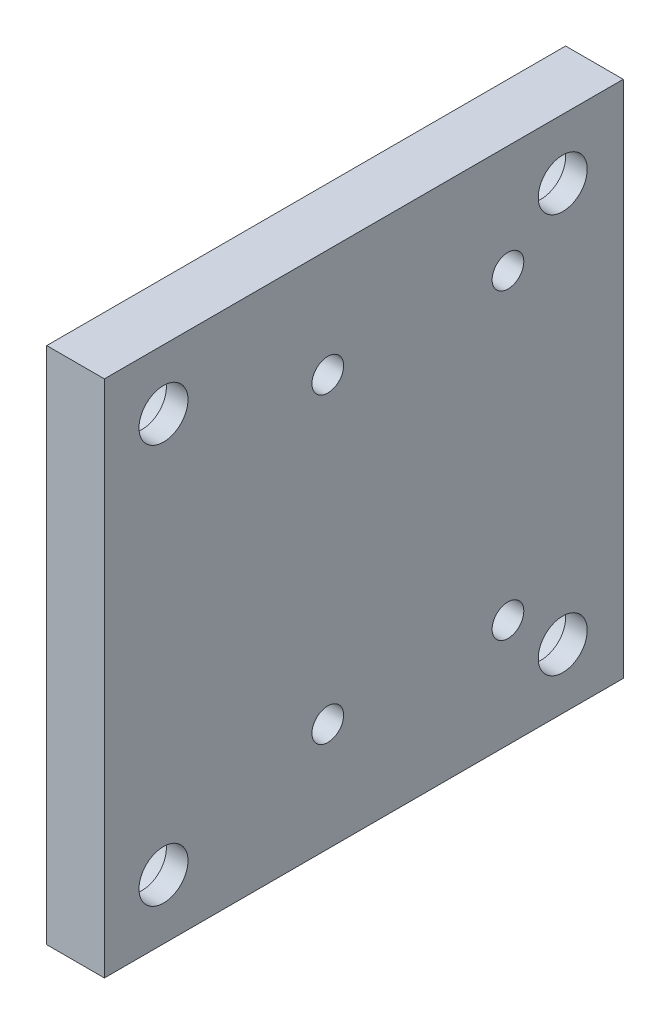
ISO-10303-21;
HEADER;
FILE_DESCRIPTION(('STEP AP214'),'2;1');
FILE_NAME('part.step','',(''),(''),'','','');
FILE_SCHEMA(('AUTOMOTIVE_DESIGN { 1 0 10303 214 1 1 1 1 }'));
ENDSEC;
DATA;
#1=APPLICATION_CONTEXT('core data for automotive mechanical design processes');
#2=APPLICATION_PROTOCOL_DEFINITION('international standard','automotive_design',2000,#1);
#3=PRODUCT_CONTEXT('',#1,'mechanical');
#4=PRODUCT('Part','Part','',(#3));
#5=PRODUCT_RELATED_PRODUCT_CATEGORY('part','',(#4));
#6=PRODUCT_DEFINITION_FORMATION('','',#4);
#7=PRODUCT_DEFINITION_CONTEXT('part definition',#1,'design');
#8=PRODUCT_DEFINITION('design','',#6,#7);
#9=PRODUCT_DEFINITION_SHAPE('','',#8);
#10=(LENGTH_UNIT() NAMED_UNIT(*) SI_UNIT(.MILLI.,.METRE.));
#11=(NAMED_UNIT(*) PLANE_ANGLE_UNIT() SI_UNIT($,.RADIAN.));
#12=(NAMED_UNIT(*) SI_UNIT($,.STERADIAN.) SOLID_ANGLE_UNIT());
#13=UNCERTAINTY_MEASURE_WITH_UNIT(LENGTH_MEASURE(1.E-05),#10,'distance_accuracy_value','');
#14=(GEOMETRIC_REPRESENTATION_CONTEXT(3) GLOBAL_UNCERTAINTY_ASSIGNED_CONTEXT((#13)) GLOBAL_UNIT_ASSIGNED_CONTEXT((#10,
#11,#12)) REPRESENTATION_CONTEXT('',''));
#15=CARTESIAN_POINT('',(0.,0.,0.));
#16=DIRECTION('',(0.,0.,1.));
#17=DIRECTION('',(1.,0.,0.));
#18=AXIS2_PLACEMENT_3D('',#15,#16,#17);
#19=CARTESIAN_POINT('',(-8.9,-18.,112.5));
#20=DIRECTION('',(0.,1.,0.));
#21=DIRECTION('',(0.,0.,1.));
#22=AXIS2_PLACEMENT_3D('',#19,#20,#21);
#23=PLANE('',#22);
#24=DIRECTION('',(0.,0.,-1.));
#25=VECTOR('',#24,1.);
#26=CARTESIAN_POINT('',(-12.9,-18.,112.5));
#27=LINE('',#26,#25);
#28=CARTESIAN_POINT('',(-12.9,-18.,112.5));
#29=VERTEX_POINT('',#28);
#30=CARTESIAN_POINT('',(-12.9,-18.,76.5));
#31=VERTEX_POINT('',#30);
#32=EDGE_CURVE('E107',#29,#31,#27,.T.);
#33=ORIENTED_EDGE('',*,*,#32,.T.);
#34=DIRECTION('',(-1.,0.,0.));
#35=VECTOR('',#34,1.);
#36=CARTESIAN_POINT('',(-8.9,-18.,76.5));
#37=LINE('',#36,#35);
#38=CARTESIAN_POINT('',(-8.9,-18.,76.5));
#39=VERTEX_POINT('',#38);
#40=EDGE_CURVE('E11',#39,#31,#37,.T.);
#41=ORIENTED_EDGE('',*,*,#40,.F.);
#42=DIRECTION('',(0.,0.,-1.));
#43=VECTOR('',#42,1.);
#44=CARTESIAN_POINT('',(-8.9,-18.,112.5));
#45=LINE('',#44,#43);
#46=CARTESIAN_POINT('',(-8.9,-18.,112.5));
#47=VERTEX_POINT('',#46);
#48=EDGE_CURVE('E94',#47,#39,#45,.T.);
#49=ORIENTED_EDGE('',*,*,#48,.F.);
#50=DIRECTION('',(-1.,0.,0.));
#51=VECTOR('',#50,1.);
#52=CARTESIAN_POINT('',(-8.9,-18.,112.5));
#53=LINE('',#52,#51);
#54=EDGE_CURVE('E103',#47,#29,#53,.T.);
#55=ORIENTED_EDGE('',*,*,#54,.T.);
#56=EDGE_LOOP('',(#33,#41,#49,#55));
#57=FACE_BOUND('',#56,.T.);
#58=ADVANCED_FACE('F41',(#57),#23,.F.);
#59=CARTESIAN_POINT('',(-8.9,-18.,76.5));
#60=DIRECTION('',(0.,0.,1.));
#61=DIRECTION('',(1.,0.,0.));
#62=AXIS2_PLACEMENT_3D('',#59,#60,#61);
#63=PLANE('',#62);
#64=DIRECTION('',(0.,1.,0.));
#65=VECTOR('',#64,1.);
#66=CARTESIAN_POINT('',(-12.9,-18.,76.5));
#67=LINE('',#66,#65);
#68=CARTESIAN_POINT('',(-12.9,18.,76.5));
#69=VERTEX_POINT('',#68);
#70=EDGE_CURVE('E98',#31,#69,#67,.T.);
#71=ORIENTED_EDGE('',*,*,#70,.T.);
#72=DIRECTION('',(-1.,0.,0.));
#73=VECTOR('',#72,1.);
#74=CARTESIAN_POINT('',(-8.9,18.,76.5));
#75=LINE('',#74,#73);
#76=CARTESIAN_POINT('',(-8.9,18.,76.5));
#77=VERTEX_POINT('',#76);
#78=EDGE_CURVE('E50',#77,#69,#75,.T.);
#79=ORIENTED_EDGE('',*,*,#78,.F.);
#80=DIRECTION('',(0.,1.,0.));
#81=VECTOR('',#80,1.);
#82=CARTESIAN_POINT('',(-8.9,-18.,76.5));
#83=LINE('',#82,#81);
#84=EDGE_CURVE('E89',#39,#77,#83,.T.);
#85=ORIENTED_EDGE('',*,*,#84,.F.);
#86=ORIENTED_EDGE('',*,*,#40,.T.);
#87=EDGE_LOOP('',(#71,#79,#85,#86));
#88=FACE_BOUND('',#87,.T.);
#89=ADVANCED_FACE('F97',(#88),#63,.F.);
#90=CARTESIAN_POINT('',(-8.9,18.,76.5));
#91=DIRECTION('',(0.,-1.,0.));
#92=DIRECTION('',(0.,0.,-1.));
#93=AXIS2_PLACEMENT_3D('',#90,#91,#92);
#94=PLANE('',#93);
#95=DIRECTION('',(0.,0.,1.));
#96=VECTOR('',#95,1.);
#97=CARTESIAN_POINT('',(-12.9,18.,76.5));
#98=LINE('',#97,#96);
#99=CARTESIAN_POINT('',(-12.9,18.,112.5));
#100=VERTEX_POINT('',#99);
#101=EDGE_CURVE('E76',#69,#100,#98,.T.);
#102=ORIENTED_EDGE('',*,*,#101,.T.);
#103=DIRECTION('',(-1.,0.,0.));
#104=VECTOR('',#103,1.);
#105=CARTESIAN_POINT('',(-8.9,18.,112.5));
#106=LINE('',#105,#104);
#107=CARTESIAN_POINT('',(-8.9,18.,112.5));
#108=VERTEX_POINT('',#107);
#109=EDGE_CURVE('E99',#108,#100,#106,.T.);
#110=ORIENTED_EDGE('',*,*,#109,.F.);
#111=DIRECTION('',(0.,0.,1.));
#112=VECTOR('',#111,1.);
#113=CARTESIAN_POINT('',(-8.9,18.,76.5));
#114=LINE('',#113,#112);
#115=EDGE_CURVE('E92',#77,#108,#114,.T.);
#116=ORIENTED_EDGE('',*,*,#115,.F.);
#117=ORIENTED_EDGE('',*,*,#78,.T.);
#118=EDGE_LOOP('',(#102,#110,#116,#117));
#119=FACE_BOUND('',#118,.T.);
#120=ADVANCED_FACE('F101',(#119),#94,.F.);
#121=CARTESIAN_POINT('',(-8.9,18.,112.5));
#122=DIRECTION('',(0.,0.,-1.));
#123=DIRECTION('',(-1.,0.,0.));
#124=AXIS2_PLACEMENT_3D('',#121,#122,#123);
#125=PLANE('',#124);
#126=DIRECTION('',(0.,-1.,0.));
#127=VECTOR('',#126,1.);
#128=CARTESIAN_POINT('',(-12.9,18.,112.5));
#129=LINE('',#128,#127);
#130=EDGE_CURVE('E82',#100,#29,#129,.T.);
#131=ORIENTED_EDGE('',*,*,#130,.T.);
#132=ORIENTED_EDGE('',*,*,#54,.F.);
#133=DIRECTION('',(0.,-1.,0.));
#134=VECTOR('',#133,1.);
#135=CARTESIAN_POINT('',(-8.9,18.,112.5));
#136=LINE('',#135,#134);
#137=EDGE_CURVE('E59',#108,#47,#136,.T.);
#138=ORIENTED_EDGE('',*,*,#137,.F.);
#139=ORIENTED_EDGE('',*,*,#109,.T.);
#140=EDGE_LOOP('',(#131,#132,#138,#139));
#141=FACE_BOUND('',#140,.T.);
#142=ADVANCED_FACE('F226',(#141),#125,.F.);
#143=CARTESIAN_POINT('',(-8.9,0.,0.));
#144=DIRECTION('',(1.,0.,0.));
#145=DIRECTION('',(0.,0.,-1.));
#146=AXIS2_PLACEMENT_3D('',#143,#144,#145);
#147=PLANE('',#146);
#148=CARTESIAN_POINT('',(-8.9,-10.5,84.5));
#149=DIRECTION('',(1.,0.,0.));
#150=DIRECTION('',(0.,0.,-1.));
#151=AXIS2_PLACEMENT_3D('',#148,#149,#150);
#152=CIRCLE('',#151,1.1);
#153=CARTESIAN_POINT('',(-8.9,-10.5,83.4));
#154=VERTEX_POINT('',#153);
#155=EDGE_CURVE('E162',#154,#154,#152,.F.);
#156=ORIENTED_EDGE('',*,*,#155,.T.);
#157=EDGE_LOOP('',(#156));
#158=FACE_BOUND('',#157,.T.);
#159=CARTESIAN_POINT('',(-8.9,10.5,97.));
#160=DIRECTION('',(1.,0.,0.));
#161=DIRECTION('',(0.,0.,-1.));
#162=AXIS2_PLACEMENT_3D('',#159,#160,#161);
#163=CIRCLE('',#162,1.1);
#164=CARTESIAN_POINT('',(-8.9,10.5,95.9));
#165=VERTEX_POINT('',#164);
#166=EDGE_CURVE('E151',#165,#165,#163,.F.);
#167=ORIENTED_EDGE('',*,*,#166,.T.);
#168=EDGE_LOOP('',(#167));
#169=FACE_BOUND('',#168,.T.);
#170=CARTESIAN_POINT('',(-8.9,10.5,84.5));
#171=DIRECTION('',(1.,0.,0.));
#172=DIRECTION('',(0.,0.,-1.));
#173=AXIS2_PLACEMENT_3D('',#170,#171,#172);
#174=CIRCLE('',#173,1.1);
#175=CARTESIAN_POINT('',(-8.9,10.5,83.4));
#176=VERTEX_POINT('',#175);
#177=EDGE_CURVE('E148',#176,#176,#174,.F.);
#178=ORIENTED_EDGE('',*,*,#177,.T.);
#179=EDGE_LOOP('',(#178));
#180=FACE_BOUND('',#179,.T.);
#181=CARTESIAN_POINT('',(-8.9,-10.5,97.));
#182=DIRECTION('',(1.,0.,0.));
#183=DIRECTION('',(0.,0.,-1.));
#184=AXIS2_PLACEMENT_3D('',#181,#182,#183);
#185=CIRCLE('',#184,1.1);
#186=CARTESIAN_POINT('',(-8.9,-10.5,95.9));
#187=VERTEX_POINT('',#186);
#188=EDGE_CURVE('E145',#187,#187,#185,.F.);
#189=ORIENTED_EDGE('',*,*,#188,.T.);
#190=EDGE_LOOP('',(#189));
#191=FACE_BOUND('',#190,.T.);
#192=CARTESIAN_POINT('',(-8.9,-13.85,108.4));
#193=DIRECTION('',(1.,0.,0.));
#194=DIRECTION('',(0.,0.,-1.));
#195=AXIS2_PLACEMENT_3D('',#192,#193,#194);
#196=CIRCLE('',#195,1.69999999999999);
#197=CARTESIAN_POINT('',(-8.9,-13.85,106.7));
#198=VERTEX_POINT('',#197);
#199=EDGE_CURVE('E110',#198,#198,#196,.F.);
#200=ORIENTED_EDGE('',*,*,#199,.T.);
#201=EDGE_LOOP('',(#200));
#202=FACE_BOUND('',#201,.T.);
#203=CARTESIAN_POINT('',(-8.9,13.85,80.7));
#204=DIRECTION('',(1.,0.,0.));
#205=DIRECTION('',(0.,0.,-1.));
#206=AXIS2_PLACEMENT_3D('',#203,#204,#205);
#207=CIRCLE('',#206,1.69999999999999);
#208=CARTESIAN_POINT('',(-8.9,13.85,79.));
#209=VERTEX_POINT('',#208);
#210=EDGE_CURVE('E181',#209,#209,#207,.F.);
#211=ORIENTED_EDGE('',*,*,#210,.T.);
#212=EDGE_LOOP('',(#211));
#213=FACE_BOUND('',#212,.T.);
#214=CARTESIAN_POINT('',(-8.9,13.85,108.4));
#215=DIRECTION('',(1.,0.,0.));
#216=DIRECTION('',(0.,0.,-1.));
#217=AXIS2_PLACEMENT_3D('',#214,#215,#216);
#218=CIRCLE('',#217,1.69999999999999);
#219=CARTESIAN_POINT('',(-8.9,13.85,106.7));
#220=VERTEX_POINT('',#219);
#221=EDGE_CURVE('E178',#220,#220,#218,.F.);
#222=ORIENTED_EDGE('',*,*,#221,.T.);
#223=EDGE_LOOP('',(#222));
#224=FACE_BOUND('',#223,.T.);
#225=CARTESIAN_POINT('',(-8.9,-13.85,80.7));
#226=DIRECTION('',(1.,0.,0.));
#227=DIRECTION('',(0.,0.,-1.));
#228=AXIS2_PLACEMENT_3D('',#225,#226,#227);
#229=CIRCLE('',#228,1.69999999999999);
#230=CARTESIAN_POINT('',(-8.9,-13.85,79.));
#231=VERTEX_POINT('',#230);
#232=EDGE_CURVE('E141',#231,#231,#229,.F.);
#233=ORIENTED_EDGE('',*,*,#232,.T.);
#234=EDGE_LOOP('',(#233));
#235=FACE_BOUND('',#234,.T.);
#236=ORIENTED_EDGE('',*,*,#48,.T.);
#237=ORIENTED_EDGE('',*,*,#84,.T.);
#238=ORIENTED_EDGE('',*,*,#115,.T.);
#239=ORIENTED_EDGE('',*,*,#137,.T.);
#240=EDGE_LOOP('',(#236,#237,#238,#239));
#241=FACE_BOUND('',#240,.T.);
#242=ADVANCED_FACE('F90',(#158,#169,#180,#191,#202,#213,#224,#235,#241),#147,.T.);
#243=CARTESIAN_POINT('',(-12.9,0.,0.));
#244=DIRECTION('',(1.,0.,0.));
#245=DIRECTION('',(0.,0.,-1.));
#246=AXIS2_PLACEMENT_3D('',#243,#244,#245);
#247=PLANE('',#246);
#248=CARTESIAN_POINT('',(-12.9,-10.5,84.5));
#249=DIRECTION('',(1.,0.,0.));
#250=DIRECTION('',(0.,0.,-1.));
#251=AXIS2_PLACEMENT_3D('',#248,#249,#250);
#252=CIRCLE('',#251,1.1);
#253=CARTESIAN_POINT('',(-12.9,-10.5,83.4));
#254=VERTEX_POINT('',#253);
#255=EDGE_CURVE('E44',#254,#254,#252,.F.);
#256=ORIENTED_EDGE('',*,*,#255,.F.);
#257=EDGE_LOOP('',(#256));
#258=FACE_BOUND('',#257,.T.);
#259=CARTESIAN_POINT('',(-12.9,10.5,97.));
#260=DIRECTION('',(1.,0.,0.));
#261=DIRECTION('',(0.,0.,-1.));
#262=AXIS2_PLACEMENT_3D('',#259,#260,#261);
#263=CIRCLE('',#262,1.1);
#264=CARTESIAN_POINT('',(-12.9,10.5,95.9));
#265=VERTEX_POINT('',#264);
#266=EDGE_CURVE('E149',#265,#265,#263,.F.);
#267=ORIENTED_EDGE('',*,*,#266,.F.);
#268=EDGE_LOOP('',(#267));
#269=FACE_BOUND('',#268,.T.);
#270=CARTESIAN_POINT('',(-12.9,10.5,84.5));
#271=DIRECTION('',(1.,0.,0.));
#272=DIRECTION('',(0.,0.,-1.));
#273=AXIS2_PLACEMENT_3D('',#270,#271,#272);
#274=CIRCLE('',#273,1.1);
#275=CARTESIAN_POINT('',(-12.9,10.5,83.4));
#276=VERTEX_POINT('',#275);
#277=EDGE_CURVE('E146',#276,#276,#274,.F.);
#278=ORIENTED_EDGE('',*,*,#277,.F.);
#279=EDGE_LOOP('',(#278));
#280=FACE_BOUND('',#279,.T.);
#281=CARTESIAN_POINT('',(-12.9,-10.5,97.));
#282=DIRECTION('',(1.,0.,0.));
#283=DIRECTION('',(0.,0.,-1.));
#284=AXIS2_PLACEMENT_3D('',#281,#282,#283);
#285=CIRCLE('',#284,1.1);
#286=CARTESIAN_POINT('',(-12.9,-10.5,95.9));
#287=VERTEX_POINT('',#286);
#288=EDGE_CURVE('E142',#287,#287,#285,.F.);
#289=ORIENTED_EDGE('',*,*,#288,.F.);
#290=EDGE_LOOP('',(#289));
#291=FACE_BOUND('',#290,.T.);
#292=CARTESIAN_POINT('',(-12.9,-13.85,108.4));
#293=DIRECTION('',(1.,0.,0.));
#294=DIRECTION('',(0.,0.,-1.));
#295=AXIS2_PLACEMENT_3D('',#292,#293,#294);
#296=CIRCLE('',#295,3.10000000000001);
#297=CARTESIAN_POINT('',(-12.9,-13.85,105.3));
#298=VERTEX_POINT('',#297);
#299=EDGE_CURVE('E138',#298,#298,#296,.F.);
#300=ORIENTED_EDGE('',*,*,#299,.F.);
#301=EDGE_LOOP('',(#300));
#302=FACE_BOUND('',#301,.T.);
#303=CARTESIAN_POINT('',(-12.9,13.85,80.7));
#304=DIRECTION('',(1.,0.,0.));
#305=DIRECTION('',(0.,0.,-1.));
#306=AXIS2_PLACEMENT_3D('',#303,#304,#305);
#307=CIRCLE('',#306,3.10000000000001);
#308=CARTESIAN_POINT('',(-12.9,13.85,77.6));
#309=VERTEX_POINT('',#308);
#310=EDGE_CURVE('E135',#309,#309,#307,.F.);
#311=ORIENTED_EDGE('',*,*,#310,.F.);
#312=EDGE_LOOP('',(#311));
#313=FACE_BOUND('',#312,.T.);
#314=CARTESIAN_POINT('',(-12.9,13.85,108.4));
#315=DIRECTION('',(1.,0.,0.));
#316=DIRECTION('',(0.,0.,-1.));
#317=AXIS2_PLACEMENT_3D('',#314,#315,#316);
#318=CIRCLE('',#317,3.10000000000001);
#319=CARTESIAN_POINT('',(-12.9,13.85,105.3));
#320=VERTEX_POINT('',#319);
#321=EDGE_CURVE('E132',#320,#320,#318,.F.);
#322=ORIENTED_EDGE('',*,*,#321,.F.);
#323=EDGE_LOOP('',(#322));
#324=FACE_BOUND('',#323,.T.);
#325=CARTESIAN_POINT('',(-12.9,-13.85,80.7));
#326=DIRECTION('',(1.,0.,0.));
#327=DIRECTION('',(0.,0.,-1.));
#328=AXIS2_PLACEMENT_3D('',#325,#326,#327);
#329=CIRCLE('',#328,3.10000000000001);
#330=CARTESIAN_POINT('',(-12.9,-13.85,77.6));
#331=VERTEX_POINT('',#330);
#332=EDGE_CURVE('E129',#331,#331,#329,.F.);
#333=ORIENTED_EDGE('',*,*,#332,.F.);
#334=EDGE_LOOP('',(#333));
#335=FACE_BOUND('',#334,.T.);
#336=ORIENTED_EDGE('',*,*,#32,.F.);
#337=ORIENTED_EDGE('',*,*,#130,.F.);
#338=ORIENTED_EDGE('',*,*,#101,.F.);
#339=ORIENTED_EDGE('',*,*,#70,.F.);
#340=EDGE_LOOP('',(#336,#337,#338,#339));
#341=FACE_BOUND('',#340,.T.);
#342=ADVANCED_FACE('F214',(#258,#269,#280,#291,#302,#313,#324,#335,#341),#247,.F.);
#343=CARTESIAN_POINT('',(-7.9,-13.85,80.7));
#344=DIRECTION('',(-1.,0.,0.));
#345=DIRECTION('',(0.,0.,1.));
#346=AXIS2_PLACEMENT_3D('',#343,#344,#345);
#347=CYLINDRICAL_SURFACE('',#346,1.69999999999999);
#348=CARTESIAN_POINT('',(-10.4,-13.85,80.7));
#349=DIRECTION('',(1.,0.,0.));
#350=DIRECTION('',(0.,0.,-1.));
#351=AXIS2_PLACEMENT_3D('',#348,#349,#350);
#352=CIRCLE('',#351,1.69999999999999);
#353=CARTESIAN_POINT('',(-10.4,-13.85,79.));
#354=VERTEX_POINT('',#353);
#355=EDGE_CURVE('E126',#354,#354,#352,.T.);
#356=ORIENTED_EDGE('',*,*,#355,.F.);
#357=EDGE_LOOP('',(#356));
#358=FACE_BOUND('',#357,.T.);
#359=ORIENTED_EDGE('',*,*,#232,.F.);
#360=EDGE_LOOP('',(#359));
#361=FACE_BOUND('',#360,.T.);
#362=ADVANCED_FACE('F216',(#358,#361),#347,.F.);
#363=CARTESIAN_POINT('',(-7.9,13.85,108.4));
#364=DIRECTION('',(-1.,0.,0.));
#365=DIRECTION('',(0.,0.,1.));
#366=AXIS2_PLACEMENT_3D('',#363,#364,#365);
#367=CYLINDRICAL_SURFACE('',#366,1.69999999999999);
#368=CARTESIAN_POINT('',(-10.4,13.85,108.4));
#369=DIRECTION('',(1.,0.,0.));
#370=DIRECTION('',(0.,0.,-1.));
#371=AXIS2_PLACEMENT_3D('',#368,#369,#370);
#372=CIRCLE('',#371,1.69999999999999);
#373=CARTESIAN_POINT('',(-10.4,13.85,106.7));
#374=VERTEX_POINT('',#373);
#375=EDGE_CURVE('E123',#374,#374,#372,.T.);
#376=ORIENTED_EDGE('',*,*,#375,.F.);
#377=EDGE_LOOP('',(#376));
#378=FACE_BOUND('',#377,.T.);
#379=ORIENTED_EDGE('',*,*,#221,.F.);
#380=EDGE_LOOP('',(#379));
#381=FACE_BOUND('',#380,.T.);
#382=ADVANCED_FACE('F202',(#378,#381),#367,.F.);
#383=CARTESIAN_POINT('',(-7.9,13.85,80.7));
#384=DIRECTION('',(-1.,0.,0.));
#385=DIRECTION('',(0.,0.,1.));
#386=AXIS2_PLACEMENT_3D('',#383,#384,#385);
#387=CYLINDRICAL_SURFACE('',#386,1.69999999999999);
#388=CARTESIAN_POINT('',(-10.4,13.85,80.7));
#389=DIRECTION('',(1.,0.,0.));
#390=DIRECTION('',(0.,0.,-1.));
#391=AXIS2_PLACEMENT_3D('',#388,#389,#390);
#392=CIRCLE('',#391,1.69999999999999);
#393=CARTESIAN_POINT('',(-10.4,13.85,79.));
#394=VERTEX_POINT('',#393);
#395=EDGE_CURVE('E119',#394,#394,#392,.T.);
#396=ORIENTED_EDGE('',*,*,#395,.F.);
#397=EDGE_LOOP('',(#396));
#398=FACE_BOUND('',#397,.T.);
#399=ORIENTED_EDGE('',*,*,#210,.F.);
#400=EDGE_LOOP('',(#399));
#401=FACE_BOUND('',#400,.T.);
#402=ADVANCED_FACE('F192',(#398,#401),#387,.F.);
#403=CARTESIAN_POINT('',(-7.9,-13.85,108.4));
#404=DIRECTION('',(-1.,0.,0.));
#405=DIRECTION('',(0.,0.,1.));
#406=AXIS2_PLACEMENT_3D('',#403,#404,#405);
#407=CYLINDRICAL_SURFACE('',#406,1.69999999999999);
#408=CARTESIAN_POINT('',(-10.4,-13.85,108.4));
#409=DIRECTION('',(1.,0.,0.));
#410=DIRECTION('',(0.,0.,-1.));
#411=AXIS2_PLACEMENT_3D('',#408,#409,#410);
#412=CIRCLE('',#411,1.69999999999999);
#413=CARTESIAN_POINT('',(-10.4,-13.85,106.7));
#414=VERTEX_POINT('',#413);
#415=EDGE_CURVE('E116',#414,#414,#412,.T.);
#416=ORIENTED_EDGE('',*,*,#415,.F.);
#417=EDGE_LOOP('',(#416));
#418=FACE_BOUND('',#417,.T.);
#419=ORIENTED_EDGE('',*,*,#199,.F.);
#420=EDGE_LOOP('',(#419));
#421=FACE_BOUND('',#420,.T.);
#422=ADVANCED_FACE('F189',(#418,#421),#407,.F.);
#423=CARTESIAN_POINT('',(-10.4,-13.85,108.4));
#424=DIRECTION('',(-1.,0.,0.));
#425=DIRECTION('',(0.,0.,1.));
#426=AXIS2_PLACEMENT_3D('',#423,#424,#425);
#427=CYLINDRICAL_SURFACE('',#426,3.10000000000001);
#428=CARTESIAN_POINT('',(-10.4,-13.85,108.4));
#429=DIRECTION('',(1.,0.,0.));
#430=DIRECTION('',(0.,0.,-1.));
#431=AXIS2_PLACEMENT_3D('',#428,#429,#430);
#432=CIRCLE('',#431,3.10000000000001);
#433=CARTESIAN_POINT('',(-10.4,-13.85,105.3));
#434=VERTEX_POINT('',#433);
#435=EDGE_CURVE('E169',#434,#434,#432,.T.);
#436=ORIENTED_EDGE('',*,*,#435,.T.);
#437=EDGE_LOOP('',(#436));
#438=FACE_BOUND('',#437,.T.);
#439=ORIENTED_EDGE('',*,*,#299,.T.);
#440=EDGE_LOOP('',(#439));
#441=FACE_BOUND('',#440,.T.);
#442=ADVANCED_FACE('F191',(#438,#441),#427,.F.);
#443=CARTESIAN_POINT('',(-10.4,-13.85,108.4));
#444=DIRECTION('',(1.,0.,0.));
#445=DIRECTION('',(0.,0.,-1.));
#446=AXIS2_PLACEMENT_3D('',#443,#444,#445);
#447=PLANE('',#446);
#448=ORIENTED_EDGE('',*,*,#415,.T.);
#449=EDGE_LOOP('',(#448));
#450=FACE_BOUND('',#449,.T.);
#451=ORIENTED_EDGE('',*,*,#435,.F.);
#452=EDGE_LOOP('',(#451));
#453=FACE_BOUND('',#452,.T.);
#454=ADVANCED_FACE('F199',(#450,#453),#447,.F.);
#455=CARTESIAN_POINT('',(-10.4,13.85,80.7));
#456=DIRECTION('',(-1.,0.,0.));
#457=DIRECTION('',(0.,0.,1.));
#458=AXIS2_PLACEMENT_3D('',#455,#456,#457);
#459=CYLINDRICAL_SURFACE('',#458,3.10000000000001);
#460=CARTESIAN_POINT('',(-10.4,13.85,80.7));
#461=DIRECTION('',(1.,0.,0.));
#462=DIRECTION('',(0.,0.,-1.));
#463=AXIS2_PLACEMENT_3D('',#460,#461,#462);
#464=CIRCLE('',#463,3.10000000000001);
#465=CARTESIAN_POINT('',(-10.4,13.85,77.6));
#466=VERTEX_POINT('',#465);
#467=EDGE_CURVE('E168',#466,#466,#464,.T.);
#468=ORIENTED_EDGE('',*,*,#467,.T.);
#469=EDGE_LOOP('',(#468));
#470=FACE_BOUND('',#469,.T.);
#471=ORIENTED_EDGE('',*,*,#310,.T.);
#472=EDGE_LOOP('',(#471));
#473=FACE_BOUND('',#472,.T.);
#474=ADVANCED_FACE('F282',(#470,#473),#459,.F.);
#475=CARTESIAN_POINT('',(-10.4,13.85,80.7));
#476=DIRECTION('',(1.,0.,0.));
#477=DIRECTION('',(0.,0.,-1.));
#478=AXIS2_PLACEMENT_3D('',#475,#476,#477);
#479=PLANE('',#478);
#480=ORIENTED_EDGE('',*,*,#395,.T.);
#481=EDGE_LOOP('',(#480));
#482=FACE_BOUND('',#481,.T.);
#483=ORIENTED_EDGE('',*,*,#467,.F.);
#484=EDGE_LOOP('',(#483));
#485=FACE_BOUND('',#484,.T.);
#486=ADVANCED_FACE('F292',(#482,#485),#479,.F.);
#487=CARTESIAN_POINT('',(-10.4,13.85,108.4));
#488=DIRECTION('',(-1.,0.,0.));
#489=DIRECTION('',(0.,0.,1.));
#490=AXIS2_PLACEMENT_3D('',#487,#488,#489);
#491=CYLINDRICAL_SURFACE('',#490,3.10000000000001);
#492=CARTESIAN_POINT('',(-10.4,13.85,108.4));
#493=DIRECTION('',(1.,0.,0.));
#494=DIRECTION('',(0.,0.,-1.));
#495=AXIS2_PLACEMENT_3D('',#492,#493,#494);
#496=CIRCLE('',#495,3.10000000000001);
#497=CARTESIAN_POINT('',(-10.4,13.85,105.3));
#498=VERTEX_POINT('',#497);
#499=EDGE_CURVE('E165',#498,#498,#496,.T.);
#500=ORIENTED_EDGE('',*,*,#499,.T.);
#501=EDGE_LOOP('',(#500));
#502=FACE_BOUND('',#501,.T.);
#503=ORIENTED_EDGE('',*,*,#321,.T.);
#504=EDGE_LOOP('',(#503));
#505=FACE_BOUND('',#504,.T.);
#506=ADVANCED_FACE('F302',(#502,#505),#491,.F.);
#507=CARTESIAN_POINT('',(-10.4,13.85,108.4));
#508=DIRECTION('',(1.,0.,0.));
#509=DIRECTION('',(0.,0.,-1.));
#510=AXIS2_PLACEMENT_3D('',#507,#508,#509);
#511=PLANE('',#510);
#512=ORIENTED_EDGE('',*,*,#375,.T.);
#513=EDGE_LOOP('',(#512));
#514=FACE_BOUND('',#513,.T.);
#515=ORIENTED_EDGE('',*,*,#499,.F.);
#516=EDGE_LOOP('',(#515));
#517=FACE_BOUND('',#516,.T.);
#518=ADVANCED_FACE('F312',(#514,#517),#511,.F.);
#519=CARTESIAN_POINT('',(-10.4,-13.85,80.7));
#520=DIRECTION('',(-1.,0.,0.));
#521=DIRECTION('',(0.,0.,1.));
#522=AXIS2_PLACEMENT_3D('',#519,#520,#521);
#523=CYLINDRICAL_SURFACE('',#522,3.10000000000001);
#524=CARTESIAN_POINT('',(-10.4,-13.85,80.7));
#525=DIRECTION('',(1.,0.,0.));
#526=DIRECTION('',(0.,0.,-1.));
#527=AXIS2_PLACEMENT_3D('',#524,#525,#526);
#528=CIRCLE('',#527,3.10000000000001);
#529=CARTESIAN_POINT('',(-10.4,-13.85,77.6));
#530=VERTEX_POINT('',#529);
#531=EDGE_CURVE('E120',#530,#530,#528,.T.);
#532=ORIENTED_EDGE('',*,*,#531,.T.);
#533=EDGE_LOOP('',(#532));
#534=FACE_BOUND('',#533,.T.);
#535=ORIENTED_EDGE('',*,*,#332,.T.);
#536=EDGE_LOOP('',(#535));
#537=FACE_BOUND('',#536,.T.);
#538=ADVANCED_FACE('F322',(#534,#537),#523,.F.);
#539=CARTESIAN_POINT('',(-10.4,-13.85,80.7));
#540=DIRECTION('',(1.,0.,0.));
#541=DIRECTION('',(0.,0.,-1.));
#542=AXIS2_PLACEMENT_3D('',#539,#540,#541);
#543=PLANE('',#542);
#544=ORIENTED_EDGE('',*,*,#355,.T.);
#545=EDGE_LOOP('',(#544));
#546=FACE_BOUND('',#545,.T.);
#547=ORIENTED_EDGE('',*,*,#531,.F.);
#548=EDGE_LOOP('',(#547));
#549=FACE_BOUND('',#548,.T.);
#550=ADVANCED_FACE('F332',(#546,#549),#543,.F.);
#551=CARTESIAN_POINT('',(-7.9,-10.5,97.));
#552=DIRECTION('',(-1.,0.,0.));
#553=DIRECTION('',(0.,0.,1.));
#554=AXIS2_PLACEMENT_3D('',#551,#552,#553);
#555=CYLINDRICAL_SURFACE('',#554,1.1);
#556=ORIENTED_EDGE('',*,*,#188,.F.);
#557=EDGE_LOOP('',(#556));
#558=FACE_BOUND('',#557,.T.);
#559=ORIENTED_EDGE('',*,*,#288,.T.);
#560=EDGE_LOOP('',(#559));
#561=FACE_BOUND('',#560,.T.);
#562=ADVANCED_FACE('F342',(#558,#561),#555,.F.);
#563=CARTESIAN_POINT('',(-7.9,10.5,84.5));
#564=DIRECTION('',(-1.,0.,0.));
#565=DIRECTION('',(0.,0.,1.));
#566=AXIS2_PLACEMENT_3D('',#563,#564,#565);
#567=CYLINDRICAL_SURFACE('',#566,1.1);
#568=ORIENTED_EDGE('',*,*,#177,.F.);
#569=EDGE_LOOP('',(#568));
#570=FACE_BOUND('',#569,.T.);
#571=ORIENTED_EDGE('',*,*,#277,.T.);
#572=EDGE_LOOP('',(#571));
#573=FACE_BOUND('',#572,.T.);
#574=ADVANCED_FACE('F351',(#570,#573),#567,.F.);
#575=CARTESIAN_POINT('',(-7.9,10.5,97.));
#576=DIRECTION('',(-1.,0.,0.));
#577=DIRECTION('',(0.,0.,1.));
#578=AXIS2_PLACEMENT_3D('',#575,#576,#577);
#579=CYLINDRICAL_SURFACE('',#578,1.1);
#580=ORIENTED_EDGE('',*,*,#166,.F.);
#581=EDGE_LOOP('',(#580));
#582=FACE_BOUND('',#581,.T.);
#583=ORIENTED_EDGE('',*,*,#266,.T.);
#584=EDGE_LOOP('',(#583));
#585=FACE_BOUND('',#584,.T.);
#586=ADVANCED_FACE('F361',(#582,#585),#579,.F.);
#587=CARTESIAN_POINT('',(-7.9,-10.5,84.5));
#588=DIRECTION('',(-1.,0.,0.));
#589=DIRECTION('',(0.,0.,1.));
#590=AXIS2_PLACEMENT_3D('',#587,#588,#589);
#591=CYLINDRICAL_SURFACE('',#590,1.1);
#592=ORIENTED_EDGE('',*,*,#155,.F.);
#593=EDGE_LOOP('',(#592));
#594=FACE_BOUND('',#593,.T.);
#595=ORIENTED_EDGE('',*,*,#255,.T.);
#596=EDGE_LOOP('',(#595));
#597=FACE_BOUND('',#596,.T.);
#598=ADVANCED_FACE('F371',(#594,#597),#591,.F.);
#599=CLOSED_SHELL('',(#58,#89,#120,#142,#242,#342,#362,#382,#402,#422,#442,#454,#474,#486,#506,
#518,#538,#550,#562,#574,#586,#598));
#600=MANIFOLD_SOLID_BREP('B2',#599);
#601=ADVANCED_BREP_SHAPE_REPRESENTATION('',(#18,#600),#14);
#602=SHAPE_DEFINITION_REPRESENTATION(#9,#601);
ENDSEC;
END-ISO-10303-21;
